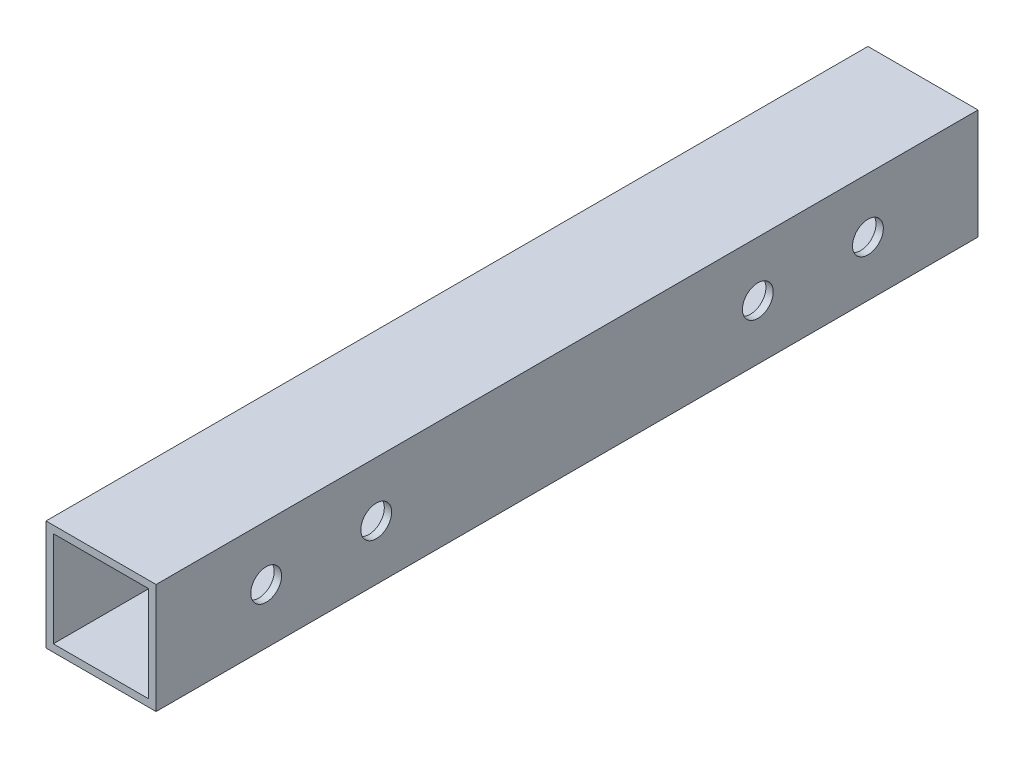
ISO-10303-21;
HEADER;
FILE_DESCRIPTION(('STEP AP214'),'2;1');
FILE_NAME('part.step','',(''),(''),'','','');
FILE_SCHEMA(('AUTOMOTIVE_DESIGN { 1 0 10303 214 1 1 1 1 }'));
ENDSEC;
DATA;
#1=APPLICATION_CONTEXT('core data for automotive mechanical design processes');
#2=APPLICATION_PROTOCOL_DEFINITION('international standard','automotive_design',2000,#1);
#3=PRODUCT_CONTEXT('',#1,'mechanical');
#4=PRODUCT('Part','Part','',(#3));
#5=PRODUCT_RELATED_PRODUCT_CATEGORY('part','',(#4));
#6=PRODUCT_DEFINITION_FORMATION('','',#4);
#7=PRODUCT_DEFINITION_CONTEXT('part definition',#1,'design');
#8=PRODUCT_DEFINITION('design','',#6,#7);
#9=PRODUCT_DEFINITION_SHAPE('','',#8);
#10=(LENGTH_UNIT() NAMED_UNIT(*) SI_UNIT(.MILLI.,.METRE.));
#11=(NAMED_UNIT(*) PLANE_ANGLE_UNIT() SI_UNIT($,.RADIAN.));
#12=(NAMED_UNIT(*) SI_UNIT($,.STERADIAN.) SOLID_ANGLE_UNIT());
#13=UNCERTAINTY_MEASURE_WITH_UNIT(LENGTH_MEASURE(1.E-05),#10,'distance_accuracy_value','');
#14=(GEOMETRIC_REPRESENTATION_CONTEXT(3) GLOBAL_UNCERTAINTY_ASSIGNED_CONTEXT((#13)) GLOBAL_UNIT_ASSIGNED_CONTEXT((#10,
#11,#12)) REPRESENTATION_CONTEXT('',''));
#15=CARTESIAN_POINT('',(0.,0.,0.));
#16=DIRECTION('',(0.,0.,1.));
#17=DIRECTION('',(1.,0.,0.));
#18=AXIS2_PLACEMENT_3D('',#15,#16,#17);
#19=CARTESIAN_POINT('',(0.,0.,112.));
#20=DIRECTION('',(0.,0.,1.));
#21=DIRECTION('',(1.,0.,0.));
#22=AXIS2_PLACEMENT_3D('',#19,#20,#21);
#23=PLANE('',#22);
#24=DIRECTION('',(0.,1.,0.));
#25=VECTOR('',#24,1.);
#26=CARTESIAN_POINT('',(7.5,7.5,112.));
#27=LINE('',#26,#25);
#28=CARTESIAN_POINT('',(7.5,-7.5,112.));
#29=VERTEX_POINT('',#28);
#30=CARTESIAN_POINT('',(7.5,7.5,112.));
#31=VERTEX_POINT('',#30);
#32=EDGE_CURVE('E167',#29,#31,#27,.T.);
#33=ORIENTED_EDGE('',*,*,#32,.T.);
#34=DIRECTION('',(-1.,0.,0.));
#35=VECTOR('',#34,1.);
#36=CARTESIAN_POINT('',(-7.5,7.5,112.));
#37=LINE('',#36,#35);
#38=CARTESIAN_POINT('',(-7.5,7.5,112.));
#39=VERTEX_POINT('',#38);
#40=EDGE_CURVE('E168',#31,#39,#37,.T.);
#41=ORIENTED_EDGE('',*,*,#40,.T.);
#42=DIRECTION('',(0.,-1.,0.));
#43=VECTOR('',#42,1.);
#44=CARTESIAN_POINT('',(-7.5,7.5,112.));
#45=LINE('',#44,#43);
#46=CARTESIAN_POINT('',(-7.5,-7.5,112.));
#47=VERTEX_POINT('',#46);
#48=EDGE_CURVE('E173',#39,#47,#45,.T.);
#49=ORIENTED_EDGE('',*,*,#48,.T.);
#50=DIRECTION('',(1.,0.,0.));
#51=VECTOR('',#50,1.);
#52=CARTESIAN_POINT('',(-7.5,-7.5,112.));
#53=LINE('',#52,#51);
#54=EDGE_CURVE('E177',#47,#29,#53,.T.);
#55=ORIENTED_EDGE('',*,*,#54,.T.);
#56=EDGE_LOOP('',(#33,#41,#49,#55));
#57=FACE_BOUND('',#56,.T.);
#58=DIRECTION('',(-1.,0.,0.));
#59=VECTOR('',#58,1.);
#60=CARTESIAN_POINT('',(-6.49999999999999,6.5,112.));
#61=LINE('',#60,#59);
#62=CARTESIAN_POINT('',(6.5,6.5,112.));
#63=VERTEX_POINT('',#62);
#64=CARTESIAN_POINT('',(-6.49999999999999,6.5,112.));
#65=VERTEX_POINT('',#64);
#66=EDGE_CURVE('E123',#63,#65,#61,.T.);
#67=ORIENTED_EDGE('',*,*,#66,.F.);
#68=DIRECTION('',(0.,1.,0.));
#69=VECTOR('',#68,1.);
#70=CARTESIAN_POINT('',(6.5,6.5,112.));
#71=LINE('',#70,#69);
#72=CARTESIAN_POINT('',(6.5,-6.5,112.));
#73=VERTEX_POINT('',#72);
#74=EDGE_CURVE('E113',#73,#63,#71,.T.);
#75=ORIENTED_EDGE('',*,*,#74,.F.);
#76=DIRECTION('',(1.,0.,0.));
#77=VECTOR('',#76,1.);
#78=CARTESIAN_POINT('',(-6.49999999999999,-6.5,112.));
#79=LINE('',#78,#77);
#80=CARTESIAN_POINT('',(-6.49999999999999,-6.5,112.));
#81=VERTEX_POINT('',#80);
#82=EDGE_CURVE('E142',#81,#73,#79,.T.);
#83=ORIENTED_EDGE('',*,*,#82,.F.);
#84=DIRECTION('',(0.,-1.,0.));
#85=VECTOR('',#84,1.);
#86=CARTESIAN_POINT('',(-6.49999999999999,6.5,112.));
#87=LINE('',#86,#85);
#88=EDGE_CURVE('E137',#65,#81,#87,.T.);
#89=ORIENTED_EDGE('',*,*,#88,.F.);
#90=EDGE_LOOP('',(#67,#75,#83,#89));
#91=FACE_BOUND('',#90,.T.);
#92=ADVANCED_FACE('F50',(#57,#91),#23,.T.);
#93=CARTESIAN_POINT('',(0.,0.,0.));
#94=DIRECTION('',(0.,0.,1.));
#95=DIRECTION('',(1.,0.,0.));
#96=AXIS2_PLACEMENT_3D('',#93,#94,#95);
#97=PLANE('',#96);
#98=DIRECTION('',(0.,1.,0.));
#99=VECTOR('',#98,1.);
#100=CARTESIAN_POINT('',(7.5,7.5,0.));
#101=LINE('',#100,#99);
#102=CARTESIAN_POINT('',(7.5,-7.5,0.));
#103=VERTEX_POINT('',#102);
#104=CARTESIAN_POINT('',(7.5,7.5,0.));
#105=VERTEX_POINT('',#104);
#106=EDGE_CURVE('E134',#103,#105,#101,.T.);
#107=ORIENTED_EDGE('',*,*,#106,.F.);
#108=DIRECTION('',(1.,0.,0.));
#109=VECTOR('',#108,1.);
#110=CARTESIAN_POINT('',(-7.5,-7.5,0.));
#111=LINE('',#110,#109);
#112=CARTESIAN_POINT('',(-7.5,-7.5,0.));
#113=VERTEX_POINT('',#112);
#114=EDGE_CURVE('E171',#113,#103,#111,.T.);
#115=ORIENTED_EDGE('',*,*,#114,.F.);
#116=DIRECTION('',(0.,-1.,0.));
#117=VECTOR('',#116,1.);
#118=CARTESIAN_POINT('',(-7.5,7.5,0.));
#119=LINE('',#118,#117);
#120=CARTESIAN_POINT('',(-7.5,7.5,0.));
#121=VERTEX_POINT('',#120);
#122=EDGE_CURVE('E187',#121,#113,#119,.T.);
#123=ORIENTED_EDGE('',*,*,#122,.F.);
#124=DIRECTION('',(-1.,0.,0.));
#125=VECTOR('',#124,1.);
#126=CARTESIAN_POINT('',(-7.5,7.5,0.));
#127=LINE('',#126,#125);
#128=EDGE_CURVE('E184',#105,#121,#127,.T.);
#129=ORIENTED_EDGE('',*,*,#128,.F.);
#130=EDGE_LOOP('',(#107,#115,#123,#129));
#131=FACE_BOUND('',#130,.T.);
#132=DIRECTION('',(0.,1.,0.));
#133=VECTOR('',#132,1.);
#134=CARTESIAN_POINT('',(6.5,6.5,0.));
#135=LINE('',#134,#133);
#136=CARTESIAN_POINT('',(6.5,-6.5,0.));
#137=VERTEX_POINT('',#136);
#138=CARTESIAN_POINT('',(6.5,6.5,0.));
#139=VERTEX_POINT('',#138);
#140=EDGE_CURVE('E71',#137,#139,#135,.T.);
#141=ORIENTED_EDGE('',*,*,#140,.T.);
#142=DIRECTION('',(-1.,0.,0.));
#143=VECTOR('',#142,1.);
#144=CARTESIAN_POINT('',(-6.49999999999999,6.5,0.));
#145=LINE('',#144,#143);
#146=CARTESIAN_POINT('',(-6.49999999999999,6.5,0.));
#147=VERTEX_POINT('',#146);
#148=EDGE_CURVE('E131',#139,#147,#145,.T.);
#149=ORIENTED_EDGE('',*,*,#148,.T.);
#150=DIRECTION('',(0.,-1.,0.));
#151=VECTOR('',#150,1.);
#152=CARTESIAN_POINT('',(-6.49999999999999,6.5,0.));
#153=LINE('',#152,#151);
#154=CARTESIAN_POINT('',(-6.49999999999999,-6.5,0.));
#155=VERTEX_POINT('',#154);
#156=EDGE_CURVE('E153',#147,#155,#153,.T.);
#157=ORIENTED_EDGE('',*,*,#156,.T.);
#158=DIRECTION('',(1.,0.,0.));
#159=VECTOR('',#158,1.);
#160=CARTESIAN_POINT('',(-6.49999999999999,-6.5,0.));
#161=LINE('',#160,#159);
#162=EDGE_CURVE('E125',#155,#137,#161,.T.);
#163=ORIENTED_EDGE('',*,*,#162,.T.);
#164=EDGE_LOOP('',(#141,#149,#157,#163));
#165=FACE_BOUND('',#164,.T.);
#166=ADVANCED_FACE('F268',(#131,#165),#97,.F.);
#167=CARTESIAN_POINT('',(7.5,7.5,112.));
#168=DIRECTION('',(-1.,0.,0.));
#169=DIRECTION('',(0.,-1.,0.));
#170=AXIS2_PLACEMENT_3D('',#167,#168,#169);
#171=PLANE('',#170);
#172=CARTESIAN_POINT('',(7.5,0.,15.));
#173=DIRECTION('',(1.,0.,0.));
#174=DIRECTION('',(0.,1.,0.));
#175=AXIS2_PLACEMENT_3D('',#172,#173,#174);
#176=CIRCLE('',#175,2.1);
#177=CARTESIAN_POINT('',(7.5,2.1,15.));
#178=VERTEX_POINT('',#177);
#179=EDGE_CURVE('E210',#178,#178,#176,.T.);
#180=ORIENTED_EDGE('',*,*,#179,.F.);
#181=EDGE_LOOP('',(#180));
#182=FACE_BOUND('',#181,.T.);
#183=CARTESIAN_POINT('',(7.5,0.,82.));
#184=DIRECTION('',(1.,0.,0.));
#185=DIRECTION('',(0.,-1.,0.));
#186=AXIS2_PLACEMENT_3D('',#183,#184,#185);
#187=CIRCLE('',#186,2.1);
#188=CARTESIAN_POINT('',(7.5,-2.10000000000001,82.));
#189=VERTEX_POINT('',#188);
#190=EDGE_CURVE('E337',#189,#189,#187,.T.);
#191=ORIENTED_EDGE('',*,*,#190,.F.);
#192=EDGE_LOOP('',(#191));
#193=FACE_BOUND('',#192,.T.);
#194=CARTESIAN_POINT('',(7.5,0.,97.));
#195=DIRECTION('',(1.,0.,0.));
#196=DIRECTION('',(0.,-1.,0.));
#197=AXIS2_PLACEMENT_3D('',#194,#195,#196);
#198=CIRCLE('',#197,2.1);
#199=CARTESIAN_POINT('',(7.5,-2.10000000000001,97.));
#200=VERTEX_POINT('',#199);
#201=EDGE_CURVE('E335',#200,#200,#198,.T.);
#202=ORIENTED_EDGE('',*,*,#201,.F.);
#203=EDGE_LOOP('',(#202));
#204=FACE_BOUND('',#203,.T.);
#205=CARTESIAN_POINT('',(7.5,0.,30.));
#206=DIRECTION('',(1.,0.,0.));
#207=DIRECTION('',(0.,1.,0.));
#208=AXIS2_PLACEMENT_3D('',#205,#206,#207);
#209=CIRCLE('',#208,2.1);
#210=CARTESIAN_POINT('',(7.5,2.1,30.));
#211=VERTEX_POINT('',#210);
#212=EDGE_CURVE('E336',#211,#211,#209,.T.);
#213=ORIENTED_EDGE('',*,*,#212,.F.);
#214=EDGE_LOOP('',(#213));
#215=FACE_BOUND('',#214,.T.);
#216=ORIENTED_EDGE('',*,*,#106,.T.);
#217=DIRECTION('',(0.,0.,-1.));
#218=VECTOR('',#217,1.);
#219=CARTESIAN_POINT('',(7.5,7.5,112.));
#220=LINE('',#219,#218);
#221=EDGE_CURVE('E11',#31,#105,#220,.T.);
#222=ORIENTED_EDGE('',*,*,#221,.F.);
#223=ORIENTED_EDGE('',*,*,#32,.F.);
#224=DIRECTION('',(0.,0.,-1.));
#225=VECTOR('',#224,1.);
#226=CARTESIAN_POINT('',(7.5,-7.5,112.));
#227=LINE('',#226,#225);
#228=EDGE_CURVE('E180',#29,#103,#227,.T.);
#229=ORIENTED_EDGE('',*,*,#228,.T.);
#230=EDGE_LOOP('',(#216,#222,#223,#229));
#231=FACE_BOUND('',#230,.T.);
#232=ADVANCED_FACE('F47',(#182,#193,#204,#215,#231),#171,.F.);
#233=CARTESIAN_POINT('',(-7.5,7.5,112.));
#234=DIRECTION('',(0.,-1.,0.));
#235=DIRECTION('',(0.,0.,-1.));
#236=AXIS2_PLACEMENT_3D('',#233,#234,#235);
#237=PLANE('',#236);
#238=ORIENTED_EDGE('',*,*,#128,.T.);
#239=DIRECTION('',(0.,0.,-1.));
#240=VECTOR('',#239,1.);
#241=CARTESIAN_POINT('',(-7.5,7.5,112.));
#242=LINE('',#241,#240);
#243=EDGE_CURVE('E60',#39,#121,#242,.T.);
#244=ORIENTED_EDGE('',*,*,#243,.F.);
#245=ORIENTED_EDGE('',*,*,#40,.F.);
#246=ORIENTED_EDGE('',*,*,#221,.T.);
#247=EDGE_LOOP('',(#238,#244,#245,#246));
#248=FACE_BOUND('',#247,.T.);
#249=ADVANCED_FACE('F284',(#248),#237,.F.);
#250=CARTESIAN_POINT('',(-7.5,7.5,112.));
#251=DIRECTION('',(1.,0.,0.));
#252=DIRECTION('',(0.,0.,-1.));
#253=AXIS2_PLACEMENT_3D('',#250,#251,#252);
#254=PLANE('',#253);
#255=CARTESIAN_POINT('',(-7.5,0.,15.));
#256=DIRECTION('',(1.,0.,0.));
#257=DIRECTION('',(0.,0.,-1.));
#258=AXIS2_PLACEMENT_3D('',#255,#256,#257);
#259=CIRCLE('',#258,2.1);
#260=CARTESIAN_POINT('',(-7.5,0.,12.9));
#261=VERTEX_POINT('',#260);
#262=EDGE_CURVE('E147',#261,#261,#259,.T.);
#263=ORIENTED_EDGE('',*,*,#262,.T.);
#264=EDGE_LOOP('',(#263));
#265=FACE_BOUND('',#264,.T.);
#266=CARTESIAN_POINT('',(-7.5,0.,82.));
#267=DIRECTION('',(1.,0.,0.));
#268=DIRECTION('',(0.,0.,-1.));
#269=AXIS2_PLACEMENT_3D('',#266,#267,#268);
#270=CIRCLE('',#269,2.1);
#271=CARTESIAN_POINT('',(-7.5,0.,79.9));
#272=VERTEX_POINT('',#271);
#273=EDGE_CURVE('E224',#272,#272,#270,.T.);
#274=ORIENTED_EDGE('',*,*,#273,.T.);
#275=EDGE_LOOP('',(#274));
#276=FACE_BOUND('',#275,.T.);
#277=CARTESIAN_POINT('',(-7.5,0.,97.));
#278=DIRECTION('',(1.,0.,0.));
#279=DIRECTION('',(0.,0.,-1.));
#280=AXIS2_PLACEMENT_3D('',#277,#278,#279);
#281=CIRCLE('',#280,2.1);
#282=CARTESIAN_POINT('',(-7.5,0.,94.9));
#283=VERTEX_POINT('',#282);
#284=EDGE_CURVE('E220',#283,#283,#281,.T.);
#285=ORIENTED_EDGE('',*,*,#284,.T.);
#286=EDGE_LOOP('',(#285));
#287=FACE_BOUND('',#286,.T.);
#288=CARTESIAN_POINT('',(-7.5,0.,30.));
#289=DIRECTION('',(1.,0.,0.));
#290=DIRECTION('',(0.,0.,-1.));
#291=AXIS2_PLACEMENT_3D('',#288,#289,#290);
#292=CIRCLE('',#291,2.1);
#293=CARTESIAN_POINT('',(-7.5,0.,27.9));
#294=VERTEX_POINT('',#293);
#295=EDGE_CURVE('E215',#294,#294,#292,.T.);
#296=ORIENTED_EDGE('',*,*,#295,.T.);
#297=EDGE_LOOP('',(#296));
#298=FACE_BOUND('',#297,.T.);
#299=ORIENTED_EDGE('',*,*,#122,.T.);
#300=DIRECTION('',(0.,0.,-1.));
#301=VECTOR('',#300,1.);
#302=CARTESIAN_POINT('',(-7.5,-7.5,112.));
#303=LINE('',#302,#301);
#304=EDGE_CURVE('E195',#47,#113,#303,.T.);
#305=ORIENTED_EDGE('',*,*,#304,.F.);
#306=ORIENTED_EDGE('',*,*,#48,.F.);
#307=ORIENTED_EDGE('',*,*,#243,.T.);
#308=EDGE_LOOP('',(#299,#305,#306,#307));
#309=FACE_BOUND('',#308,.T.);
#310=ADVANCED_FACE('F243',(#265,#276,#287,#298,#309),#254,.F.);
#311=CARTESIAN_POINT('',(-7.5,-7.5,112.));
#312=DIRECTION('',(0.,1.,0.));
#313=DIRECTION('',(0.,0.,1.));
#314=AXIS2_PLACEMENT_3D('',#311,#312,#313);
#315=PLANE('',#314);
#316=ORIENTED_EDGE('',*,*,#114,.T.);
#317=ORIENTED_EDGE('',*,*,#228,.F.);
#318=ORIENTED_EDGE('',*,*,#54,.F.);
#319=ORIENTED_EDGE('',*,*,#304,.T.);
#320=EDGE_LOOP('',(#316,#317,#318,#319));
#321=FACE_BOUND('',#320,.T.);
#322=ADVANCED_FACE('F279',(#321),#315,.F.);
#323=CARTESIAN_POINT('',(6.5,6.5,112.));
#324=DIRECTION('',(-1.,0.,0.));
#325=DIRECTION('',(0.,0.,1.));
#326=AXIS2_PLACEMENT_3D('',#323,#324,#325);
#327=PLANE('',#326);
#328=CARTESIAN_POINT('',(6.5,0.,15.));
#329=DIRECTION('',(-1.,0.,0.));
#330=DIRECTION('',(0.,0.,1.));
#331=AXIS2_PLACEMENT_3D('',#328,#329,#330);
#332=CIRCLE('',#331,2.1);
#333=CARTESIAN_POINT('',(6.5,0.,17.1));
#334=VERTEX_POINT('',#333);
#335=EDGE_CURVE('E240',#334,#334,#332,.T.);
#336=ORIENTED_EDGE('',*,*,#335,.F.);
#337=EDGE_LOOP('',(#336));
#338=FACE_BOUND('',#337,.T.);
#339=CARTESIAN_POINT('',(6.5,0.,82.));
#340=DIRECTION('',(-1.,0.,0.));
#341=DIRECTION('',(0.,0.,1.));
#342=AXIS2_PLACEMENT_3D('',#339,#340,#341);
#343=CIRCLE('',#342,2.1);
#344=CARTESIAN_POINT('',(6.5,0.,84.1));
#345=VERTEX_POINT('',#344);
#346=EDGE_CURVE('E216',#345,#345,#343,.T.);
#347=ORIENTED_EDGE('',*,*,#346,.F.);
#348=EDGE_LOOP('',(#347));
#349=FACE_BOUND('',#348,.T.);
#350=CARTESIAN_POINT('',(6.5,0.,97.));
#351=DIRECTION('',(-1.,0.,0.));
#352=DIRECTION('',(0.,0.,1.));
#353=AXIS2_PLACEMENT_3D('',#350,#351,#352);
#354=CIRCLE('',#353,2.1);
#355=CARTESIAN_POINT('',(6.5,0.,99.1));
#356=VERTEX_POINT('',#355);
#357=EDGE_CURVE('E211',#356,#356,#354,.T.);
#358=ORIENTED_EDGE('',*,*,#357,.F.);
#359=EDGE_LOOP('',(#358));
#360=FACE_BOUND('',#359,.T.);
#361=CARTESIAN_POINT('',(6.5,0.,30.));
#362=DIRECTION('',(-1.,0.,0.));
#363=DIRECTION('',(0.,0.,1.));
#364=AXIS2_PLACEMENT_3D('',#361,#362,#363);
#365=CIRCLE('',#364,2.1);
#366=CARTESIAN_POINT('',(6.5,0.,32.1));
#367=VERTEX_POINT('',#366);
#368=EDGE_CURVE('E206',#367,#367,#365,.T.);
#369=ORIENTED_EDGE('',*,*,#368,.F.);
#370=EDGE_LOOP('',(#369));
#371=FACE_BOUND('',#370,.T.);
#372=ORIENTED_EDGE('',*,*,#140,.F.);
#373=DIRECTION('',(0.,0.,-1.));
#374=VECTOR('',#373,1.);
#375=CARTESIAN_POINT('',(6.5,-6.5,112.));
#376=LINE('',#375,#374);
#377=EDGE_CURVE('E118',#73,#137,#376,.T.);
#378=ORIENTED_EDGE('',*,*,#377,.F.);
#379=ORIENTED_EDGE('',*,*,#74,.T.);
#380=DIRECTION('',(0.,0.,-1.));
#381=VECTOR('',#380,1.);
#382=CARTESIAN_POINT('',(6.5,6.5,112.));
#383=LINE('',#382,#381);
#384=EDGE_CURVE('E119',#63,#139,#383,.T.);
#385=ORIENTED_EDGE('',*,*,#384,.T.);
#386=EDGE_LOOP('',(#372,#378,#379,#385));
#387=FACE_BOUND('',#386,.T.);
#388=ADVANCED_FACE('F117',(#338,#349,#360,#371,#387),#327,.T.);
#389=CARTESIAN_POINT('',(-6.49999999999999,6.5,112.));
#390=DIRECTION('',(0.,-1.,0.));
#391=DIRECTION('',(0.,0.,-1.));
#392=AXIS2_PLACEMENT_3D('',#389,#390,#391);
#393=PLANE('',#392);
#394=ORIENTED_EDGE('',*,*,#148,.F.);
#395=ORIENTED_EDGE('',*,*,#384,.F.);
#396=ORIENTED_EDGE('',*,*,#66,.T.);
#397=DIRECTION('',(0.,0.,-1.));
#398=VECTOR('',#397,1.);
#399=CARTESIAN_POINT('',(-6.49999999999999,6.5,112.));
#400=LINE('',#399,#398);
#401=EDGE_CURVE('E133',#65,#147,#400,.T.);
#402=ORIENTED_EDGE('',*,*,#401,.T.);
#403=EDGE_LOOP('',(#394,#395,#396,#402));
#404=FACE_BOUND('',#403,.T.);
#405=ADVANCED_FACE('F126',(#404),#393,.T.);
#406=CARTESIAN_POINT('',(-6.49999999999999,6.5,112.));
#407=DIRECTION('',(1.,0.,0.));
#408=DIRECTION('',(0.,0.,-1.));
#409=AXIS2_PLACEMENT_3D('',#406,#407,#408);
#410=PLANE('',#409);
#411=CARTESIAN_POINT('',(-6.49999999999999,0.,15.));
#412=DIRECTION('',(1.,0.,0.));
#413=DIRECTION('',(0.,0.,-1.));
#414=AXIS2_PLACEMENT_3D('',#411,#412,#413);
#415=CIRCLE('',#414,2.1);
#416=CARTESIAN_POINT('',(-6.49999999999999,0.,12.9));
#417=VERTEX_POINT('',#416);
#418=EDGE_CURVE('E51',#417,#417,#415,.T.);
#419=ORIENTED_EDGE('',*,*,#418,.F.);
#420=EDGE_LOOP('',(#419));
#421=FACE_BOUND('',#420,.T.);
#422=CARTESIAN_POINT('',(-6.49999999999999,0.,82.));
#423=DIRECTION('',(1.,0.,0.));
#424=DIRECTION('',(0.,0.,-1.));
#425=AXIS2_PLACEMENT_3D('',#422,#423,#424);
#426=CIRCLE('',#425,2.1);
#427=CARTESIAN_POINT('',(-6.49999999999999,0.,79.9));
#428=VERTEX_POINT('',#427);
#429=EDGE_CURVE('E213',#428,#428,#426,.T.);
#430=ORIENTED_EDGE('',*,*,#429,.F.);
#431=EDGE_LOOP('',(#430));
#432=FACE_BOUND('',#431,.T.);
#433=CARTESIAN_POINT('',(-6.49999999999999,0.,97.));
#434=DIRECTION('',(1.,0.,0.));
#435=DIRECTION('',(0.,0.,-1.));
#436=AXIS2_PLACEMENT_3D('',#433,#434,#435);
#437=CIRCLE('',#436,2.1);
#438=CARTESIAN_POINT('',(-6.49999999999999,0.,94.9));
#439=VERTEX_POINT('',#438);
#440=EDGE_CURVE('E208',#439,#439,#437,.T.);
#441=ORIENTED_EDGE('',*,*,#440,.F.);
#442=EDGE_LOOP('',(#441));
#443=FACE_BOUND('',#442,.T.);
#444=CARTESIAN_POINT('',(-6.49999999999999,0.,30.));
#445=DIRECTION('',(1.,0.,0.));
#446=DIRECTION('',(0.,0.,-1.));
#447=AXIS2_PLACEMENT_3D('',#444,#445,#446);
#448=CIRCLE('',#447,2.1);
#449=CARTESIAN_POINT('',(-6.49999999999999,0.,27.9));
#450=VERTEX_POINT('',#449);
#451=EDGE_CURVE('E205',#450,#450,#448,.T.);
#452=ORIENTED_EDGE('',*,*,#451,.F.);
#453=EDGE_LOOP('',(#452));
#454=FACE_BOUND('',#453,.T.);
#455=ORIENTED_EDGE('',*,*,#156,.F.);
#456=ORIENTED_EDGE('',*,*,#401,.F.);
#457=ORIENTED_EDGE('',*,*,#88,.T.);
#458=DIRECTION('',(0.,0.,-1.));
#459=VECTOR('',#458,1.);
#460=CARTESIAN_POINT('',(-6.49999999999999,-6.5,112.));
#461=LINE('',#460,#459);
#462=EDGE_CURVE('E65',#81,#155,#461,.T.);
#463=ORIENTED_EDGE('',*,*,#462,.T.);
#464=EDGE_LOOP('',(#455,#456,#457,#463));
#465=FACE_BOUND('',#464,.T.);
#466=ADVANCED_FACE('F305',(#421,#432,#443,#454,#465),#410,.T.);
#467=CARTESIAN_POINT('',(-6.49999999999999,-6.5,112.));
#468=DIRECTION('',(0.,1.,0.));
#469=DIRECTION('',(0.,0.,1.));
#470=AXIS2_PLACEMENT_3D('',#467,#468,#469);
#471=PLANE('',#470);
#472=ORIENTED_EDGE('',*,*,#162,.F.);
#473=ORIENTED_EDGE('',*,*,#462,.F.);
#474=ORIENTED_EDGE('',*,*,#82,.T.);
#475=ORIENTED_EDGE('',*,*,#377,.T.);
#476=EDGE_LOOP('',(#472,#473,#474,#475));
#477=FACE_BOUND('',#476,.T.);
#478=ADVANCED_FACE('F304',(#477),#471,.T.);
#479=CARTESIAN_POINT('',(-47.5,0.,30.));
#480=DIRECTION('',(1.,0.,0.));
#481=DIRECTION('',(0.,1.,0.));
#482=AXIS2_PLACEMENT_3D('',#479,#480,#481);
#483=CYLINDRICAL_SURFACE('',#482,2.1);
#484=ORIENTED_EDGE('',*,*,#451,.T.);
#485=EDGE_LOOP('',(#484));
#486=FACE_BOUND('',#485,.T.);
#487=ORIENTED_EDGE('',*,*,#295,.F.);
#488=EDGE_LOOP('',(#487));
#489=FACE_BOUND('',#488,.T.);
#490=ADVANCED_FACE('F257',(#486,#489),#483,.F.);
#491=CARTESIAN_POINT('',(-47.5,0.,97.));
#492=DIRECTION('',(1.,0.,0.));
#493=DIRECTION('',(0.,1.,0.));
#494=AXIS2_PLACEMENT_3D('',#491,#492,#493);
#495=CYLINDRICAL_SURFACE('',#494,2.1);
#496=ORIENTED_EDGE('',*,*,#440,.T.);
#497=EDGE_LOOP('',(#496));
#498=FACE_BOUND('',#497,.T.);
#499=ORIENTED_EDGE('',*,*,#284,.F.);
#500=EDGE_LOOP('',(#499));
#501=FACE_BOUND('',#500,.T.);
#502=ADVANCED_FACE('F261',(#498,#501),#495,.F.);
#503=CARTESIAN_POINT('',(-47.5,0.,82.));
#504=DIRECTION('',(1.,0.,0.));
#505=DIRECTION('',(0.,1.,0.));
#506=AXIS2_PLACEMENT_3D('',#503,#504,#505);
#507=CYLINDRICAL_SURFACE('',#506,2.1);
#508=ORIENTED_EDGE('',*,*,#429,.T.);
#509=EDGE_LOOP('',(#508));
#510=FACE_BOUND('',#509,.T.);
#511=ORIENTED_EDGE('',*,*,#273,.F.);
#512=EDGE_LOOP('',(#511));
#513=FACE_BOUND('',#512,.T.);
#514=ADVANCED_FACE('F250',(#510,#513),#507,.F.);
#515=CARTESIAN_POINT('',(-47.5,0.,15.));
#516=DIRECTION('',(1.,0.,0.));
#517=DIRECTION('',(0.,1.,0.));
#518=AXIS2_PLACEMENT_3D('',#515,#516,#517);
#519=CYLINDRICAL_SURFACE('',#518,2.1);
#520=ORIENTED_EDGE('',*,*,#418,.T.);
#521=EDGE_LOOP('',(#520));
#522=FACE_BOUND('',#521,.T.);
#523=ORIENTED_EDGE('',*,*,#262,.F.);
#524=EDGE_LOOP('',(#523));
#525=FACE_BOUND('',#524,.T.);
#526=ADVANCED_FACE('F247',(#522,#525),#519,.F.);
#527=ORIENTED_EDGE('',*,*,#368,.T.);
#528=EDGE_LOOP('',(#527));
#529=FACE_BOUND('',#528,.T.);
#530=ORIENTED_EDGE('',*,*,#212,.T.);
#531=EDGE_LOOP('',(#530));
#532=FACE_BOUND('',#531,.T.);
#533=ADVANCED_FACE('F248',(#529,#532),#483,.F.);
#534=ORIENTED_EDGE('',*,*,#357,.T.);
#535=EDGE_LOOP('',(#534));
#536=FACE_BOUND('',#535,.T.);
#537=ORIENTED_EDGE('',*,*,#201,.T.);
#538=EDGE_LOOP('',(#537));
#539=FACE_BOUND('',#538,.T.);
#540=ADVANCED_FACE('F260',(#536,#539),#495,.F.);
#541=ORIENTED_EDGE('',*,*,#346,.T.);
#542=EDGE_LOOP('',(#541));
#543=FACE_BOUND('',#542,.T.);
#544=ORIENTED_EDGE('',*,*,#190,.T.);
#545=EDGE_LOOP('',(#544));
#546=FACE_BOUND('',#545,.T.);
#547=ADVANCED_FACE('F263',(#543,#546),#507,.F.);
#548=ORIENTED_EDGE('',*,*,#335,.T.);
#549=EDGE_LOOP('',(#548));
#550=FACE_BOUND('',#549,.T.);
#551=ORIENTED_EDGE('',*,*,#179,.T.);
#552=EDGE_LOOP('',(#551));
#553=FACE_BOUND('',#552,.T.);
#554=ADVANCED_FACE('F251',(#550,#553),#519,.F.);
#555=CLOSED_SHELL('',(#92,#166,#232,#249,#310,#322,#388,#405,#466,#478,#490,#502,#514,#526,#533,
#540,#547,#554));
#556=MANIFOLD_SOLID_BREP('B2',#555);
#557=ADVANCED_BREP_SHAPE_REPRESENTATION('',(#18,#556),#14);
#558=SHAPE_DEFINITION_REPRESENTATION(#9,#557);
ENDSEC;
END-ISO-10303-21;
